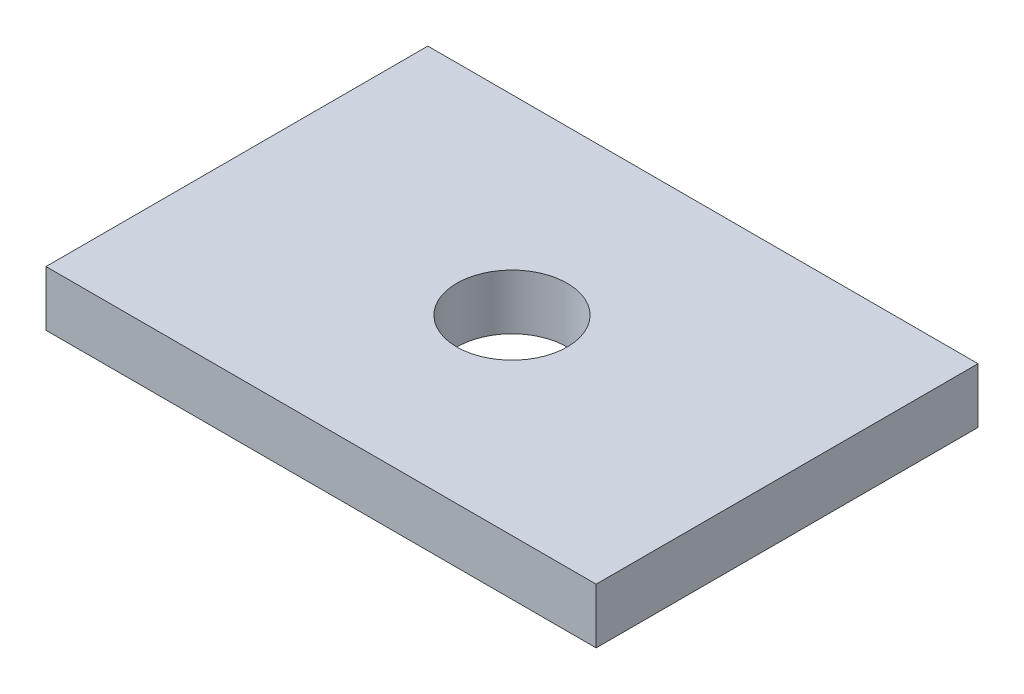
ISO-10303-21;
HEADER;
FILE_DESCRIPTION(('STEP AP214'),'2;1');
FILE_NAME('part.step','',(''),(''),'','','');
FILE_SCHEMA(('AUTOMOTIVE_DESIGN { 1 0 10303 214 1 1 1 1 }'));
ENDSEC;
DATA;
#1=APPLICATION_CONTEXT('core data for automotive mechanical design processes');
#2=APPLICATION_PROTOCOL_DEFINITION('international standard','automotive_design',2000,#1);
#3=PRODUCT_CONTEXT('',#1,'mechanical');
#4=PRODUCT('Part','Part','',(#3));
#5=PRODUCT_RELATED_PRODUCT_CATEGORY('part','',(#4));
#6=PRODUCT_DEFINITION_FORMATION('','',#4);
#7=PRODUCT_DEFINITION_CONTEXT('part definition',#1,'design');
#8=PRODUCT_DEFINITION('design','',#6,#7);
#9=PRODUCT_DEFINITION_SHAPE('','',#8);
#10=(LENGTH_UNIT() NAMED_UNIT(*) SI_UNIT(.MILLI.,.METRE.));
#11=(NAMED_UNIT(*) PLANE_ANGLE_UNIT() SI_UNIT($,.RADIAN.));
#12=(NAMED_UNIT(*) SI_UNIT($,.STERADIAN.) SOLID_ANGLE_UNIT());
#13=UNCERTAINTY_MEASURE_WITH_UNIT(LENGTH_MEASURE(1.E-05),#10,'distance_accuracy_value','');
#14=(GEOMETRIC_REPRESENTATION_CONTEXT(3) GLOBAL_UNCERTAINTY_ASSIGNED_CONTEXT((#13)) GLOBAL_UNIT_ASSIGNED_CONTEXT((#10,
#11,#12)) REPRESENTATION_CONTEXT('',''));
#15=CARTESIAN_POINT('',(0.,0.,0.));
#16=DIRECTION('',(0.,0.,1.));
#17=DIRECTION('',(1.,0.,0.));
#18=AXIS2_PLACEMENT_3D('',#15,#16,#17);
#19=CARTESIAN_POINT('',(63.2458978728292,12.7,43.9000938176109));
#20=DIRECTION('',(-1.,0.,0.));
#21=DIRECTION('',(0.,0.,1.));
#22=AXIS2_PLACEMENT_3D('',#19,#20,#21);
#23=PLANE('',#22);
#24=DIRECTION('',(0.,0.,-1.));
#25=VECTOR('',#24,1.);
#26=CARTESIAN_POINT('',(63.2458978728292,0.,43.9000938176109));
#27=LINE('',#26,#25);
#28=CARTESIAN_POINT('',(63.2458978728292,0.,43.9000938176109));
#29=VERTEX_POINT('',#28);
#30=CARTESIAN_POINT('',(63.2458978728292,0.,-43.9000938176109));
#31=VERTEX_POINT('',#30);
#32=EDGE_CURVE('E108',#29,#31,#27,.T.);
#33=ORIENTED_EDGE('',*,*,#32,.T.);
#34=DIRECTION('',(0.,-1.,0.));
#35=VECTOR('',#34,1.);
#36=CARTESIAN_POINT('',(63.2458978728292,12.7,-43.9000938176109));
#37=LINE('',#36,#35);
#38=CARTESIAN_POINT('',(63.2458978728292,12.7,-43.9000938176109));
#39=VERTEX_POINT('',#38);
#40=EDGE_CURVE('E11',#39,#31,#37,.T.);
#41=ORIENTED_EDGE('',*,*,#40,.F.);
#42=DIRECTION('',(0.,0.,-1.));
#43=VECTOR('',#42,1.);
#44=CARTESIAN_POINT('',(63.2458978728292,12.7,43.9000938176109));
#45=LINE('',#44,#43);
#46=CARTESIAN_POINT('',(63.2458978728292,12.7,43.9000938176109));
#47=VERTEX_POINT('',#46);
#48=EDGE_CURVE('E91',#47,#39,#45,.T.);
#49=ORIENTED_EDGE('',*,*,#48,.F.);
#50=DIRECTION('',(0.,-1.,0.));
#51=VECTOR('',#50,1.);
#52=CARTESIAN_POINT('',(63.2458978728292,12.7,43.9000938176109));
#53=LINE('',#52,#51);
#54=EDGE_CURVE('E104',#47,#29,#53,.T.);
#55=ORIENTED_EDGE('',*,*,#54,.T.);
#56=EDGE_LOOP('',(#33,#41,#49,#55));
#57=FACE_BOUND('',#56,.T.);
#58=ADVANCED_FACE('F39',(#57),#23,.F.);
#59=CARTESIAN_POINT('',(-63.2458978728292,12.7,-43.9000938176109));
#60=DIRECTION('',(0.,0.,1.));
#61=DIRECTION('',(1.,0.,0.));
#62=AXIS2_PLACEMENT_3D('',#59,#60,#61);
#63=PLANE('',#62);
#64=DIRECTION('',(-1.,0.,0.));
#65=VECTOR('',#64,1.);
#66=CARTESIAN_POINT('',(-63.2458978728292,0.,-43.9000938176109));
#67=LINE('',#66,#65);
#68=CARTESIAN_POINT('',(-63.2458978728292,0.,-43.9000938176109));
#69=VERTEX_POINT('',#68);
#70=EDGE_CURVE('E96',#31,#69,#67,.T.);
#71=ORIENTED_EDGE('',*,*,#70,.T.);
#72=DIRECTION('',(0.,-1.,0.));
#73=VECTOR('',#72,1.);
#74=CARTESIAN_POINT('',(-63.2458978728292,12.7,-43.9000938176109));
#75=LINE('',#74,#73);
#76=CARTESIAN_POINT('',(-63.2458978728292,12.7,-43.9000938176109));
#77=VERTEX_POINT('',#76);
#78=EDGE_CURVE('E48',#77,#69,#75,.T.);
#79=ORIENTED_EDGE('',*,*,#78,.F.);
#80=DIRECTION('',(-1.,0.,0.));
#81=VECTOR('',#80,1.);
#82=CARTESIAN_POINT('',(-63.2458978728292,12.7,-43.9000938176109));
#83=LINE('',#82,#81);
#84=EDGE_CURVE('E86',#39,#77,#83,.T.);
#85=ORIENTED_EDGE('',*,*,#84,.F.);
#86=ORIENTED_EDGE('',*,*,#40,.T.);
#87=EDGE_LOOP('',(#71,#79,#85,#86));
#88=FACE_BOUND('',#87,.T.);
#89=ADVANCED_FACE('F95',(#88),#63,.F.);
#90=CARTESIAN_POINT('',(-63.2458978728292,12.7,43.9000938176109));
#91=DIRECTION('',(1.,0.,0.));
#92=DIRECTION('',(0.,0.,-1.));
#93=AXIS2_PLACEMENT_3D('',#90,#91,#92);
#94=PLANE('',#93);
#95=DIRECTION('',(0.,0.,1.));
#96=VECTOR('',#95,1.);
#97=CARTESIAN_POINT('',(-63.2458978728292,0.,43.9000938176109));
#98=LINE('',#97,#96);
#99=CARTESIAN_POINT('',(-63.2458978728292,0.,43.9000938176109));
#100=VERTEX_POINT('',#99);
#101=EDGE_CURVE('E73',#69,#100,#98,.T.);
#102=ORIENTED_EDGE('',*,*,#101,.T.);
#103=DIRECTION('',(0.,-1.,0.));
#104=VECTOR('',#103,1.);
#105=CARTESIAN_POINT('',(-63.2458978728292,12.7,43.9000938176109));
#106=LINE('',#105,#104);
#107=CARTESIAN_POINT('',(-63.2458978728292,12.7,43.9000938176109));
#108=VERTEX_POINT('',#107);
#109=EDGE_CURVE('E98',#108,#100,#106,.T.);
#110=ORIENTED_EDGE('',*,*,#109,.F.);
#111=DIRECTION('',(0.,0.,1.));
#112=VECTOR('',#111,1.);
#113=CARTESIAN_POINT('',(-63.2458978728292,12.7,43.9000938176109));
#114=LINE('',#113,#112);
#115=EDGE_CURVE('E89',#77,#108,#114,.T.);
#116=ORIENTED_EDGE('',*,*,#115,.F.);
#117=ORIENTED_EDGE('',*,*,#78,.T.);
#118=EDGE_LOOP('',(#102,#110,#116,#117));
#119=FACE_BOUND('',#118,.T.);
#120=ADVANCED_FACE('F99',(#119),#94,.F.);
#121=CARTESIAN_POINT('',(-63.2458978728292,12.7,43.9000938176109));
#122=DIRECTION('',(0.,0.,-1.));
#123=DIRECTION('',(-1.,0.,0.));
#124=AXIS2_PLACEMENT_3D('',#121,#122,#123);
#125=PLANE('',#124);
#126=DIRECTION('',(1.,0.,0.));
#127=VECTOR('',#126,1.);
#128=CARTESIAN_POINT('',(-63.2458978728292,0.,43.9000938176109));
#129=LINE('',#128,#127);
#130=EDGE_CURVE('E79',#100,#29,#129,.T.);
#131=ORIENTED_EDGE('',*,*,#130,.T.);
#132=ORIENTED_EDGE('',*,*,#54,.F.);
#133=DIRECTION('',(1.,0.,0.));
#134=VECTOR('',#133,1.);
#135=CARTESIAN_POINT('',(-63.2458978728292,12.7,43.9000938176109));
#136=LINE('',#135,#134);
#137=EDGE_CURVE('E56',#108,#47,#136,.T.);
#138=ORIENTED_EDGE('',*,*,#137,.F.);
#139=ORIENTED_EDGE('',*,*,#109,.T.);
#140=EDGE_LOOP('',(#131,#132,#138,#139));
#141=FACE_BOUND('',#140,.T.);
#142=ADVANCED_FACE('F123',(#141),#125,.F.);
#143=CARTESIAN_POINT('',(0.,12.7,0.));
#144=DIRECTION('',(0.,-1.,0.));
#145=DIRECTION('',(0.,0.,-1.));
#146=AXIS2_PLACEMENT_3D('',#143,#144,#145);
#147=PLANE('',#146);
#148=CARTESIAN_POINT('',(0.,12.7,0.));
#149=DIRECTION('',(0.,1.,0.));
#150=DIRECTION('',(0.,0.,1.));
#151=AXIS2_PLACEMENT_3D('',#148,#149,#150);
#152=CIRCLE('',#151,12.7);
#153=CARTESIAN_POINT('',(0.,12.7,12.7));
#154=VERTEX_POINT('',#153);
#155=EDGE_CURVE('E134',#154,#154,#152,.T.);
#156=ORIENTED_EDGE('',*,*,#155,.F.);
#157=EDGE_LOOP('',(#156));
#158=FACE_BOUND('',#157,.T.);
#159=ORIENTED_EDGE('',*,*,#48,.T.);
#160=ORIENTED_EDGE('',*,*,#84,.T.);
#161=ORIENTED_EDGE('',*,*,#115,.T.);
#162=ORIENTED_EDGE('',*,*,#137,.T.);
#163=EDGE_LOOP('',(#159,#160,#161,#162));
#164=FACE_BOUND('',#163,.T.);
#165=ADVANCED_FACE('F87',(#158,#164),#147,.F.);
#166=CARTESIAN_POINT('',(0.,0.,0.));
#167=DIRECTION('',(0.,-1.,0.));
#168=DIRECTION('',(0.,0.,-1.));
#169=AXIS2_PLACEMENT_3D('',#166,#167,#168);
#170=PLANE('',#169);
#171=CARTESIAN_POINT('',(0.,0.,0.));
#172=DIRECTION('',(0.,1.,0.));
#173=DIRECTION('',(0.,0.,1.));
#174=AXIS2_PLACEMENT_3D('',#171,#172,#173);
#175=CIRCLE('',#174,12.7);
#176=CARTESIAN_POINT('',(0.,0.,12.7));
#177=VERTEX_POINT('',#176);
#178=EDGE_CURVE('E112',#177,#177,#175,.T.);
#179=ORIENTED_EDGE('',*,*,#178,.T.);
#180=EDGE_LOOP('',(#179));
#181=FACE_BOUND('',#180,.T.);
#182=ORIENTED_EDGE('',*,*,#32,.F.);
#183=ORIENTED_EDGE('',*,*,#130,.F.);
#184=ORIENTED_EDGE('',*,*,#101,.F.);
#185=ORIENTED_EDGE('',*,*,#70,.F.);
#186=EDGE_LOOP('',(#182,#183,#184,#185));
#187=FACE_BOUND('',#186,.T.);
#188=ADVANCED_FACE('F126',(#181,#187),#170,.T.);
#189=CARTESIAN_POINT('',(0.,12.7,0.));
#190=DIRECTION('',(0.,1.,0.));
#191=DIRECTION('',(0.,0.,1.));
#192=AXIS2_PLACEMENT_3D('',#189,#190,#191);
#193=CYLINDRICAL_SURFACE('',#192,12.7);
#194=ORIENTED_EDGE('',*,*,#178,.F.);
#195=EDGE_LOOP('',(#194));
#196=FACE_BOUND('',#195,.T.);
#197=ORIENTED_EDGE('',*,*,#155,.T.);
#198=EDGE_LOOP('',(#197));
#199=FACE_BOUND('',#198,.T.);
#200=ADVANCED_FACE('F140',(#196,#199),#193,.F.);
#201=CLOSED_SHELL('',(#58,#89,#120,#142,#165,#188,#200));
#202=MANIFOLD_SOLID_BREP('B2',#201);
#203=ADVANCED_BREP_SHAPE_REPRESENTATION('',(#18,#202),#14);
#204=SHAPE_DEFINITION_REPRESENTATION(#9,#203);
ENDSEC;
END-ISO-10303-21;
